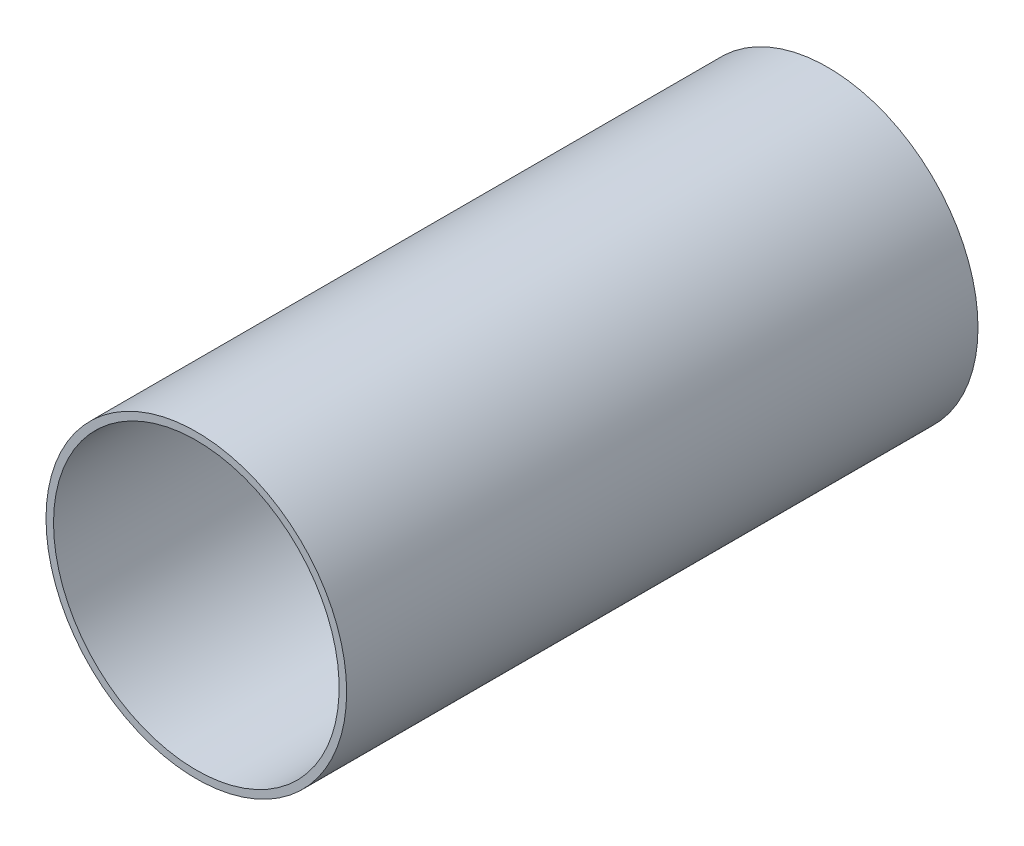
ISO-10303-21;
HEADER;
FILE_DESCRIPTION(('STEP AP214'),'2;1');
FILE_NAME('part.step','',(''),(''),'','','');
FILE_SCHEMA(('AUTOMOTIVE_DESIGN { 1 0 10303 214 1 1 1 1 }'));
ENDSEC;
DATA;
#1=APPLICATION_CONTEXT('core data for automotive mechanical design processes');
#2=APPLICATION_PROTOCOL_DEFINITION('international standard','automotive_design',2000,#1);
#3=PRODUCT_CONTEXT('',#1,'mechanical');
#4=PRODUCT('Part','Part','',(#3));
#5=PRODUCT_RELATED_PRODUCT_CATEGORY('part','',(#4));
#6=PRODUCT_DEFINITION_FORMATION('','',#4);
#7=PRODUCT_DEFINITION_CONTEXT('part definition',#1,'design');
#8=PRODUCT_DEFINITION('design','',#6,#7);
#9=PRODUCT_DEFINITION_SHAPE('','',#8);
#10=(LENGTH_UNIT() NAMED_UNIT(*) SI_UNIT(.MILLI.,.METRE.));
#11=(NAMED_UNIT(*) PLANE_ANGLE_UNIT() SI_UNIT($,.RADIAN.));
#12=(NAMED_UNIT(*) SI_UNIT($,.STERADIAN.) SOLID_ANGLE_UNIT());
#13=UNCERTAINTY_MEASURE_WITH_UNIT(LENGTH_MEASURE(1.E-05),#10,'distance_accuracy_value','');
#14=(GEOMETRIC_REPRESENTATION_CONTEXT(3) GLOBAL_UNCERTAINTY_ASSIGNED_CONTEXT((#13)) GLOBAL_UNIT_ASSIGNED_CONTEXT((#10,
#11,#12)) REPRESENTATION_CONTEXT('',''));
#15=CARTESIAN_POINT('',(0.,0.,0.));
#16=DIRECTION('',(0.,0.,1.));
#17=DIRECTION('',(1.,0.,0.));
#18=AXIS2_PLACEMENT_3D('',#15,#16,#17);
#19=CARTESIAN_POINT('',(0.,63.5,133.35));
#20=DIRECTION('',(0.,0.,1.));
#21=DIRECTION('',(1.,0.,0.));
#22=AXIS2_PLACEMENT_3D('',#19,#20,#21);
#23=PLANE('',#22);
#24=CARTESIAN_POINT('',(0.,0.,133.35));
#25=DIRECTION('',(0.,0.,-1.));
#26=DIRECTION('',(-1.,0.,0.));
#27=AXIS2_PLACEMENT_3D('',#24,#25,#26);
#28=CIRCLE('',#27,60.325);
#29=CARTESIAN_POINT('',(-60.325,0.,133.35));
#30=VERTEX_POINT('',#29);
#31=EDGE_CURVE('E10',#30,#30,#28,.T.);
#32=ORIENTED_EDGE('',*,*,#31,.T.);
#33=EDGE_LOOP('',(#32));
#34=FACE_BOUND('',#33,.T.);
#35=CARTESIAN_POINT('',(0.,0.,133.35));
#36=DIRECTION('',(0.,0.,-1.));
#37=DIRECTION('',(-1.,0.,0.));
#38=AXIS2_PLACEMENT_3D('',#35,#36,#37);
#39=CIRCLE('',#38,63.5);
#40=CARTESIAN_POINT('',(-63.5,0.,133.35));
#41=VERTEX_POINT('',#40);
#42=EDGE_CURVE('E60',#41,#41,#39,.T.);
#43=ORIENTED_EDGE('',*,*,#42,.F.);
#44=EDGE_LOOP('',(#43));
#45=FACE_BOUND('',#44,.T.);
#46=ADVANCED_FACE('F43',(#34,#45),#23,.T.);
#47=CARTESIAN_POINT('',(0.,0.,0.));
#48=DIRECTION('',(0.,0.,-1.));
#49=DIRECTION('',(-1.,0.,0.));
#50=AXIS2_PLACEMENT_3D('',#47,#48,#49);
#51=CYLINDRICAL_SURFACE('',#50,60.325);
#52=CARTESIAN_POINT('',(0.,0.,-133.35));
#53=DIRECTION('',(0.,0.,-1.));
#54=DIRECTION('',(-1.,0.,0.));
#55=AXIS2_PLACEMENT_3D('',#52,#53,#54);
#56=CIRCLE('',#55,60.325);
#57=CARTESIAN_POINT('',(-60.325,0.,-133.35));
#58=VERTEX_POINT('',#57);
#59=EDGE_CURVE('E50',#58,#58,#56,.T.);
#60=ORIENTED_EDGE('',*,*,#59,.T.);
#61=EDGE_LOOP('',(#60));
#62=FACE_BOUND('',#61,.T.);
#63=ORIENTED_EDGE('',*,*,#31,.F.);
#64=EDGE_LOOP('',(#63));
#65=FACE_BOUND('',#64,.T.);
#66=ADVANCED_FACE('F71',(#62,#65),#51,.F.);
#67=CARTESIAN_POINT('',(0.,63.5,-133.35));
#68=DIRECTION('',(0.,0.,-1.));
#69=DIRECTION('',(-1.,0.,0.));
#70=AXIS2_PLACEMENT_3D('',#67,#68,#69);
#71=PLANE('',#70);
#72=CARTESIAN_POINT('',(0.,0.,-133.35));
#73=DIRECTION('',(0.,0.,-1.));
#74=DIRECTION('',(-1.,0.,0.));
#75=AXIS2_PLACEMENT_3D('',#72,#73,#74);
#76=CIRCLE('',#75,63.5);
#77=CARTESIAN_POINT('',(-63.5,0.,-133.35));
#78=VERTEX_POINT('',#77);
#79=EDGE_CURVE('E55',#78,#78,#76,.T.);
#80=ORIENTED_EDGE('',*,*,#79,.T.);
#81=EDGE_LOOP('',(#80));
#82=FACE_BOUND('',#81,.T.);
#83=ORIENTED_EDGE('',*,*,#59,.F.);
#84=EDGE_LOOP('',(#83));
#85=FACE_BOUND('',#84,.T.);
#86=ADVANCED_FACE('F75',(#82,#85),#71,.T.);
#87=CARTESIAN_POINT('',(0.,0.,0.));
#88=DIRECTION('',(0.,0.,-1.));
#89=DIRECTION('',(-1.,0.,0.));
#90=AXIS2_PLACEMENT_3D('',#87,#88,#89);
#91=CYLINDRICAL_SURFACE('',#90,63.5);
#92=ORIENTED_EDGE('',*,*,#42,.T.);
#93=EDGE_LOOP('',(#92));
#94=FACE_BOUND('',#93,.T.);
#95=ORIENTED_EDGE('',*,*,#79,.F.);
#96=EDGE_LOOP('',(#95));
#97=FACE_BOUND('',#96,.T.);
#98=ADVANCED_FACE('F67',(#94,#97),#91,.T.);
#99=CLOSED_SHELL('',(#46,#66,#86,#98));
#100=MANIFOLD_SOLID_BREP('B2',#99);
#101=ADVANCED_BREP_SHAPE_REPRESENTATION('',(#18,#100),#14);
#102=SHAPE_DEFINITION_REPRESENTATION(#9,#101);
ENDSEC;
END-ISO-10303-21;
